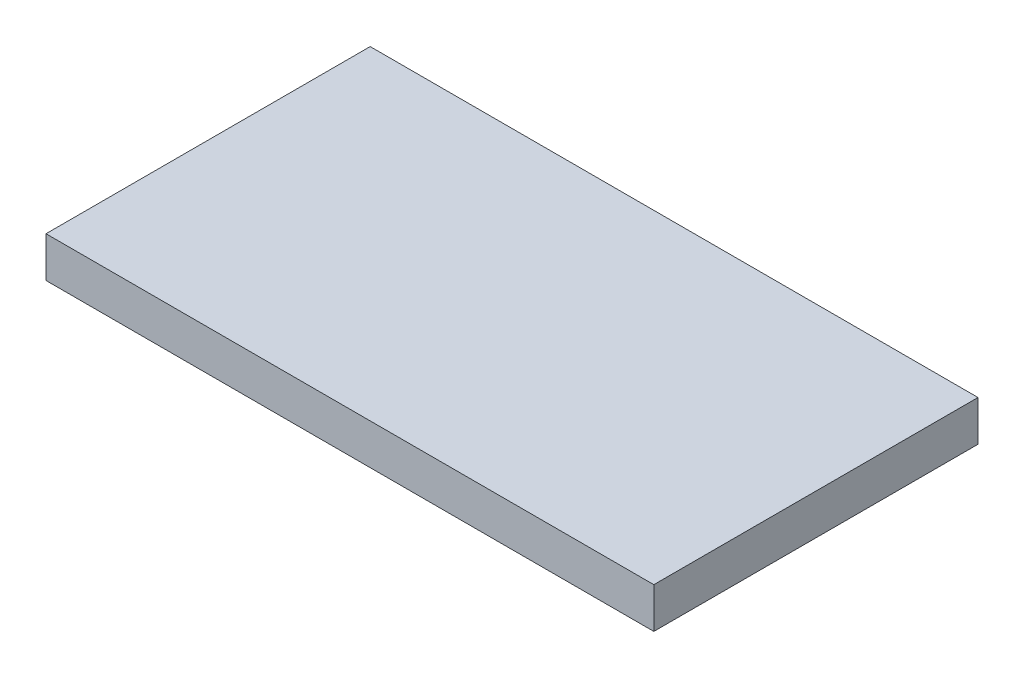
ISO-10303-21;
HEADER;
FILE_DESCRIPTION(('STEP AP214'),'2;1');
FILE_NAME('part.step','',(''),(''),'','','');
FILE_SCHEMA(('AUTOMOTIVE_DESIGN { 1 0 10303 214 1 1 1 1 }'));
ENDSEC;
DATA;
#1=APPLICATION_CONTEXT('core data for automotive mechanical design processes');
#2=APPLICATION_PROTOCOL_DEFINITION('international standard','automotive_design',2000,#1);
#3=PRODUCT_CONTEXT('',#1,'mechanical');
#4=PRODUCT('Part','Part','',(#3));
#5=PRODUCT_RELATED_PRODUCT_CATEGORY('part','',(#4));
#6=PRODUCT_DEFINITION_FORMATION('','',#4);
#7=PRODUCT_DEFINITION_CONTEXT('part definition',#1,'design');
#8=PRODUCT_DEFINITION('design','',#6,#7);
#9=PRODUCT_DEFINITION_SHAPE('','',#8);
#10=(LENGTH_UNIT() NAMED_UNIT(*) SI_UNIT(.MILLI.,.METRE.));
#11=(NAMED_UNIT(*) PLANE_ANGLE_UNIT() SI_UNIT($,.RADIAN.));
#12=(NAMED_UNIT(*) SI_UNIT($,.STERADIAN.) SOLID_ANGLE_UNIT());
#13=UNCERTAINTY_MEASURE_WITH_UNIT(LENGTH_MEASURE(1.E-05),#10,'distance_accuracy_value','');
#14=(GEOMETRIC_REPRESENTATION_CONTEXT(3) GLOBAL_UNCERTAINTY_ASSIGNED_CONTEXT((#13)) GLOBAL_UNIT_ASSIGNED_CONTEXT((#10,
#11,#12)) REPRESENTATION_CONTEXT('',''));
#15=CARTESIAN_POINT('',(0.,0.,0.));
#16=DIRECTION('',(0.,0.,1.));
#17=DIRECTION('',(1.,0.,0.));
#18=AXIS2_PLACEMENT_3D('',#15,#16,#17);
#19=CARTESIAN_POINT('',(750.,100.,400.));
#20=DIRECTION('',(-1.,0.,0.));
#21=DIRECTION('',(0.,0.,1.));
#22=AXIS2_PLACEMENT_3D('',#19,#20,#21);
#23=PLANE('',#22);
#24=DIRECTION('',(0.,0.,-1.));
#25=VECTOR('',#24,1.);
#26=CARTESIAN_POINT('',(750.,0.,400.));
#27=LINE('',#26,#25);
#28=CARTESIAN_POINT('',(750.,0.,400.));
#29=VERTEX_POINT('',#28);
#30=CARTESIAN_POINT('',(750.,0.,-400.));
#31=VERTEX_POINT('',#30);
#32=EDGE_CURVE('E102',#29,#31,#27,.T.);
#33=ORIENTED_EDGE('',*,*,#32,.T.);
#34=DIRECTION('',(0.,-1.,0.));
#35=VECTOR('',#34,1.);
#36=CARTESIAN_POINT('',(750.,100.,-400.));
#37=LINE('',#36,#35);
#38=CARTESIAN_POINT('',(750.,100.,-400.));
#39=VERTEX_POINT('',#38);
#40=EDGE_CURVE('E11',#39,#31,#37,.T.);
#41=ORIENTED_EDGE('',*,*,#40,.F.);
#42=DIRECTION('',(0.,0.,-1.));
#43=VECTOR('',#42,1.);
#44=CARTESIAN_POINT('',(750.,100.,400.));
#45=LINE('',#44,#43);
#46=CARTESIAN_POINT('',(750.,100.,400.));
#47=VERTEX_POINT('',#46);
#48=EDGE_CURVE('E90',#47,#39,#45,.T.);
#49=ORIENTED_EDGE('',*,*,#48,.F.);
#50=DIRECTION('',(0.,-1.,0.));
#51=VECTOR('',#50,1.);
#52=CARTESIAN_POINT('',(750.,100.,400.));
#53=LINE('',#52,#51);
#54=EDGE_CURVE('E98',#47,#29,#53,.T.);
#55=ORIENTED_EDGE('',*,*,#54,.T.);
#56=EDGE_LOOP('',(#33,#41,#49,#55));
#57=FACE_BOUND('',#56,.T.);
#58=ADVANCED_FACE('F39',(#57),#23,.F.);
#59=CARTESIAN_POINT('',(-750.,100.,-400.));
#60=DIRECTION('',(0.,0.,1.));
#61=DIRECTION('',(1.,0.,0.));
#62=AXIS2_PLACEMENT_3D('',#59,#60,#61);
#63=PLANE('',#62);
#64=DIRECTION('',(-1.,0.,0.));
#65=VECTOR('',#64,1.);
#66=CARTESIAN_POINT('',(-750.,0.,-400.));
#67=LINE('',#66,#65);
#68=CARTESIAN_POINT('',(-750.,0.,-400.));
#69=VERTEX_POINT('',#68);
#70=EDGE_CURVE('E94',#31,#69,#67,.T.);
#71=ORIENTED_EDGE('',*,*,#70,.T.);
#72=DIRECTION('',(0.,-1.,0.));
#73=VECTOR('',#72,1.);
#74=CARTESIAN_POINT('',(-750.,100.,-400.));
#75=LINE('',#74,#73);
#76=CARTESIAN_POINT('',(-750.,100.,-400.));
#77=VERTEX_POINT('',#76);
#78=EDGE_CURVE('E47',#77,#69,#75,.T.);
#79=ORIENTED_EDGE('',*,*,#78,.F.);
#80=DIRECTION('',(-1.,0.,0.));
#81=VECTOR('',#80,1.);
#82=CARTESIAN_POINT('',(-750.,100.,-400.));
#83=LINE('',#82,#81);
#84=EDGE_CURVE('E85',#39,#77,#83,.T.);
#85=ORIENTED_EDGE('',*,*,#84,.F.);
#86=ORIENTED_EDGE('',*,*,#40,.T.);
#87=EDGE_LOOP('',(#71,#79,#85,#86));
#88=FACE_BOUND('',#87,.T.);
#89=ADVANCED_FACE('F93',(#88),#63,.F.);
#90=CARTESIAN_POINT('',(-750.,100.,400.));
#91=DIRECTION('',(1.,0.,0.));
#92=DIRECTION('',(0.,0.,-1.));
#93=AXIS2_PLACEMENT_3D('',#90,#91,#92);
#94=PLANE('',#93);
#95=DIRECTION('',(0.,0.,1.));
#96=VECTOR('',#95,1.);
#97=CARTESIAN_POINT('',(-750.,0.,400.));
#98=LINE('',#97,#96);
#99=CARTESIAN_POINT('',(-750.,0.,400.));
#100=VERTEX_POINT('',#99);
#101=EDGE_CURVE('E72',#69,#100,#98,.T.);
#102=ORIENTED_EDGE('',*,*,#101,.T.);
#103=DIRECTION('',(0.,-1.,0.));
#104=VECTOR('',#103,1.);
#105=CARTESIAN_POINT('',(-750.,100.,400.));
#106=LINE('',#105,#104);
#107=CARTESIAN_POINT('',(-750.,100.,400.));
#108=VERTEX_POINT('',#107);
#109=EDGE_CURVE('E95',#108,#100,#106,.T.);
#110=ORIENTED_EDGE('',*,*,#109,.F.);
#111=DIRECTION('',(0.,0.,1.));
#112=VECTOR('',#111,1.);
#113=CARTESIAN_POINT('',(-750.,100.,400.));
#114=LINE('',#113,#112);
#115=EDGE_CURVE('E88',#77,#108,#114,.T.);
#116=ORIENTED_EDGE('',*,*,#115,.F.);
#117=ORIENTED_EDGE('',*,*,#78,.T.);
#118=EDGE_LOOP('',(#102,#110,#116,#117));
#119=FACE_BOUND('',#118,.T.);
#120=ADVANCED_FACE('F96',(#119),#94,.F.);
#121=CARTESIAN_POINT('',(-750.,100.,400.));
#122=DIRECTION('',(0.,0.,-1.));
#123=DIRECTION('',(-1.,0.,0.));
#124=AXIS2_PLACEMENT_3D('',#121,#122,#123);
#125=PLANE('',#124);
#126=DIRECTION('',(1.,0.,0.));
#127=VECTOR('',#126,1.);
#128=CARTESIAN_POINT('',(-750.,0.,400.));
#129=LINE('',#128,#127);
#130=EDGE_CURVE('E78',#100,#29,#129,.T.);
#131=ORIENTED_EDGE('',*,*,#130,.T.);
#132=ORIENTED_EDGE('',*,*,#54,.F.);
#133=DIRECTION('',(1.,0.,0.));
#134=VECTOR('',#133,1.);
#135=CARTESIAN_POINT('',(-750.,100.,400.));
#136=LINE('',#135,#134);
#137=EDGE_CURVE('E55',#108,#47,#136,.T.);
#138=ORIENTED_EDGE('',*,*,#137,.F.);
#139=ORIENTED_EDGE('',*,*,#109,.T.);
#140=EDGE_LOOP('',(#131,#132,#138,#139));
#141=FACE_BOUND('',#140,.T.);
#142=ADVANCED_FACE('F109',(#141),#125,.F.);
#143=CARTESIAN_POINT('',(0.,100.,0.));
#144=DIRECTION('',(0.,-1.,0.));
#145=DIRECTION('',(0.,0.,-1.));
#146=AXIS2_PLACEMENT_3D('',#143,#144,#145);
#147=PLANE('',#146);
#148=ORIENTED_EDGE('',*,*,#48,.T.);
#149=ORIENTED_EDGE('',*,*,#84,.T.);
#150=ORIENTED_EDGE('',*,*,#115,.T.);
#151=ORIENTED_EDGE('',*,*,#137,.T.);
#152=EDGE_LOOP('',(#148,#149,#150,#151));
#153=FACE_BOUND('',#152,.T.);
#154=ADVANCED_FACE('F86',(#153),#147,.F.);
#155=CARTESIAN_POINT('',(0.,0.,0.));
#156=DIRECTION('',(0.,-1.,0.));
#157=DIRECTION('',(0.,0.,-1.));
#158=AXIS2_PLACEMENT_3D('',#155,#156,#157);
#159=PLANE('',#158);
#160=ORIENTED_EDGE('',*,*,#32,.F.);
#161=ORIENTED_EDGE('',*,*,#130,.F.);
#162=ORIENTED_EDGE('',*,*,#101,.F.);
#163=ORIENTED_EDGE('',*,*,#70,.F.);
#164=EDGE_LOOP('',(#160,#161,#162,#163));
#165=FACE_BOUND('',#164,.T.);
#166=ADVANCED_FACE('F112',(#165),#159,.T.);
#167=CLOSED_SHELL('',(#58,#89,#120,#142,#154,#166));
#168=MANIFOLD_SOLID_BREP('B2',#167);
#169=ADVANCED_BREP_SHAPE_REPRESENTATION('',(#18,#168),#14);
#170=SHAPE_DEFINITION_REPRESENTATION(#9,#169);
ENDSEC;
END-ISO-10303-21;
